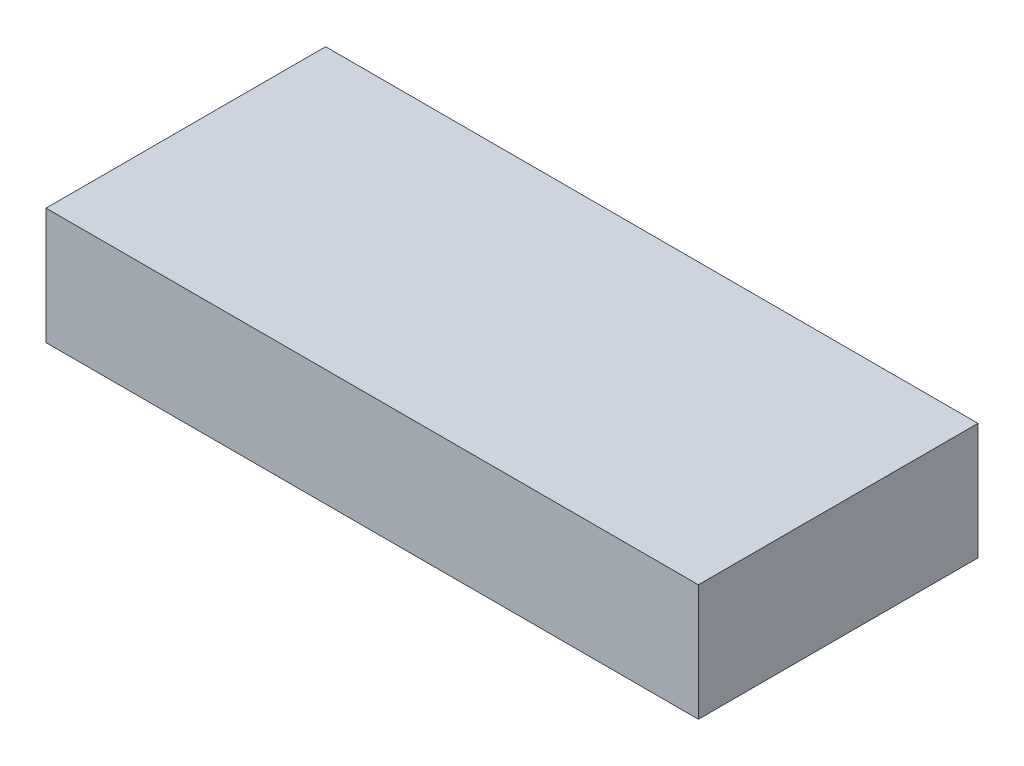
ISO-10303-21;
HEADER;
FILE_DESCRIPTION(('STEP AP214'),'2;1');
FILE_NAME('part.step','',(''),(''),'','','');
FILE_SCHEMA(('AUTOMOTIVE_DESIGN { 1 0 10303 214 1 1 1 1 }'));
ENDSEC;
DATA;
#1=APPLICATION_CONTEXT('core data for automotive mechanical design processes');
#2=APPLICATION_PROTOCOL_DEFINITION('international standard','automotive_design',2000,#1);
#3=PRODUCT_CONTEXT('',#1,'mechanical');
#4=PRODUCT('Part','Part','',(#3));
#5=PRODUCT_RELATED_PRODUCT_CATEGORY('part','',(#4));
#6=PRODUCT_DEFINITION_FORMATION('','',#4);
#7=PRODUCT_DEFINITION_CONTEXT('part definition',#1,'design');
#8=PRODUCT_DEFINITION('design','',#6,#7);
#9=PRODUCT_DEFINITION_SHAPE('','',#8);
#10=(LENGTH_UNIT() NAMED_UNIT(*) SI_UNIT(.MILLI.,.METRE.));
#11=(NAMED_UNIT(*) PLANE_ANGLE_UNIT() SI_UNIT($,.RADIAN.));
#12=(NAMED_UNIT(*) SI_UNIT($,.STERADIAN.) SOLID_ANGLE_UNIT());
#13=UNCERTAINTY_MEASURE_WITH_UNIT(LENGTH_MEASURE(1.E-05),#10,'distance_accuracy_value','');
#14=(GEOMETRIC_REPRESENTATION_CONTEXT(3) GLOBAL_UNCERTAINTY_ASSIGNED_CONTEXT((#13)) GLOBAL_UNIT_ASSIGNED_CONTEXT((#10,
#11,#12)) REPRESENTATION_CONTEXT('',''));
#15=CARTESIAN_POINT('',(0.,0.,0.));
#16=DIRECTION('',(0.,0.,1.));
#17=DIRECTION('',(1.,0.,0.));
#18=AXIS2_PLACEMENT_3D('',#15,#16,#17);
#19=CARTESIAN_POINT('',(-140.,25.,60.));
#20=DIRECTION('',(1.,0.,0.));
#21=DIRECTION('',(0.,0.,-1.));
#22=AXIS2_PLACEMENT_3D('',#19,#20,#21);
#23=PLANE('',#22);
#24=DIRECTION('',(0.,0.,1.));
#25=VECTOR('',#24,1.);
#26=CARTESIAN_POINT('',(-140.,-25.,60.));
#27=LINE('',#26,#25);
#28=CARTESIAN_POINT('',(-140.,-25.,-60.));
#29=VERTEX_POINT('',#28);
#30=CARTESIAN_POINT('',(-140.,-25.,60.));
#31=VERTEX_POINT('',#30);
#32=EDGE_CURVE('E95',#29,#31,#27,.T.);
#33=ORIENTED_EDGE('',*,*,#32,.T.);
#34=DIRECTION('',(0.,-1.,0.));
#35=VECTOR('',#34,1.);
#36=CARTESIAN_POINT('',(-140.,25.,60.));
#37=LINE('',#36,#35);
#38=CARTESIAN_POINT('',(-140.,25.,60.));
#39=VERTEX_POINT('',#38);
#40=EDGE_CURVE('E11',#39,#31,#37,.T.);
#41=ORIENTED_EDGE('',*,*,#40,.F.);
#42=DIRECTION('',(0.,0.,1.));
#43=VECTOR('',#42,1.);
#44=CARTESIAN_POINT('',(-140.,25.,60.));
#45=LINE('',#44,#43);
#46=CARTESIAN_POINT('',(-140.,25.,-60.));
#47=VERTEX_POINT('',#46);
#48=EDGE_CURVE('E83',#47,#39,#45,.T.);
#49=ORIENTED_EDGE('',*,*,#48,.F.);
#50=DIRECTION('',(0.,-1.,0.));
#51=VECTOR('',#50,1.);
#52=CARTESIAN_POINT('',(-140.,25.,-60.));
#53=LINE('',#52,#51);
#54=EDGE_CURVE('E91',#47,#29,#53,.T.);
#55=ORIENTED_EDGE('',*,*,#54,.T.);
#56=EDGE_LOOP('',(#33,#41,#49,#55));
#57=FACE_BOUND('',#56,.T.);
#58=ADVANCED_FACE('F32',(#57),#23,.F.);
#59=CARTESIAN_POINT('',(140.,25.,60.));
#60=DIRECTION('',(0.,0.,-1.));
#61=DIRECTION('',(-1.,0.,0.));
#62=AXIS2_PLACEMENT_3D('',#59,#60,#61);
#63=PLANE('',#62);
#64=DIRECTION('',(1.,0.,0.));
#65=VECTOR('',#64,1.);
#66=CARTESIAN_POINT('',(140.,-25.,60.));
#67=LINE('',#66,#65);
#68=CARTESIAN_POINT('',(140.,-25.,60.));
#69=VERTEX_POINT('',#68);
#70=EDGE_CURVE('E87',#31,#69,#67,.T.);
#71=ORIENTED_EDGE('',*,*,#70,.T.);
#72=DIRECTION('',(0.,-1.,0.));
#73=VECTOR('',#72,1.);
#74=CARTESIAN_POINT('',(140.,25.,60.));
#75=LINE('',#74,#73);
#76=CARTESIAN_POINT('',(140.,25.,60.));
#77=VERTEX_POINT('',#76);
#78=EDGE_CURVE('E40',#77,#69,#75,.T.);
#79=ORIENTED_EDGE('',*,*,#78,.F.);
#80=DIRECTION('',(1.,0.,0.));
#81=VECTOR('',#80,1.);
#82=CARTESIAN_POINT('',(140.,25.,60.));
#83=LINE('',#82,#81);
#84=EDGE_CURVE('E78',#39,#77,#83,.T.);
#85=ORIENTED_EDGE('',*,*,#84,.F.);
#86=ORIENTED_EDGE('',*,*,#40,.T.);
#87=EDGE_LOOP('',(#71,#79,#85,#86));
#88=FACE_BOUND('',#87,.T.);
#89=ADVANCED_FACE('F86',(#88),#63,.F.);
#90=CARTESIAN_POINT('',(140.,25.,60.));
#91=DIRECTION('',(-1.,0.,0.));
#92=DIRECTION('',(0.,0.,1.));
#93=AXIS2_PLACEMENT_3D('',#90,#91,#92);
#94=PLANE('',#93);
#95=DIRECTION('',(0.,0.,-1.));
#96=VECTOR('',#95,1.);
#97=CARTESIAN_POINT('',(140.,-25.,60.));
#98=LINE('',#97,#96);
#99=CARTESIAN_POINT('',(140.,-25.,-60.));
#100=VERTEX_POINT('',#99);
#101=EDGE_CURVE('E65',#69,#100,#98,.T.);
#102=ORIENTED_EDGE('',*,*,#101,.T.);
#103=DIRECTION('',(0.,-1.,0.));
#104=VECTOR('',#103,1.);
#105=CARTESIAN_POINT('',(140.,25.,-60.));
#106=LINE('',#105,#104);
#107=CARTESIAN_POINT('',(140.,25.,-60.));
#108=VERTEX_POINT('',#107);
#109=EDGE_CURVE('E88',#108,#100,#106,.T.);
#110=ORIENTED_EDGE('',*,*,#109,.F.);
#111=DIRECTION('',(0.,0.,-1.));
#112=VECTOR('',#111,1.);
#113=CARTESIAN_POINT('',(140.,25.,60.));
#114=LINE('',#113,#112);
#115=EDGE_CURVE('E81',#77,#108,#114,.T.);
#116=ORIENTED_EDGE('',*,*,#115,.F.);
#117=ORIENTED_EDGE('',*,*,#78,.T.);
#118=EDGE_LOOP('',(#102,#110,#116,#117));
#119=FACE_BOUND('',#118,.T.);
#120=ADVANCED_FACE('F89',(#119),#94,.F.);
#121=CARTESIAN_POINT('',(140.,25.,-60.));
#122=DIRECTION('',(0.,0.,1.));
#123=DIRECTION('',(1.,0.,0.));
#124=AXIS2_PLACEMENT_3D('',#121,#122,#123);
#125=PLANE('',#124);
#126=DIRECTION('',(-1.,0.,0.));
#127=VECTOR('',#126,1.);
#128=CARTESIAN_POINT('',(140.,-25.,-60.));
#129=LINE('',#128,#127);
#130=EDGE_CURVE('E71',#100,#29,#129,.T.);
#131=ORIENTED_EDGE('',*,*,#130,.T.);
#132=ORIENTED_EDGE('',*,*,#54,.F.);
#133=DIRECTION('',(-1.,0.,0.));
#134=VECTOR('',#133,1.);
#135=CARTESIAN_POINT('',(140.,25.,-60.));
#136=LINE('',#135,#134);
#137=EDGE_CURVE('E48',#108,#47,#136,.T.);
#138=ORIENTED_EDGE('',*,*,#137,.F.);
#139=ORIENTED_EDGE('',*,*,#109,.T.);
#140=EDGE_LOOP('',(#131,#132,#138,#139));
#141=FACE_BOUND('',#140,.T.);
#142=ADVANCED_FACE('F102',(#141),#125,.F.);
#143=CARTESIAN_POINT('',(0.,25.,0.));
#144=DIRECTION('',(0.,1.,0.));
#145=DIRECTION('',(0.,0.,1.));
#146=AXIS2_PLACEMENT_3D('',#143,#144,#145);
#147=PLANE('',#146);
#148=ORIENTED_EDGE('',*,*,#48,.T.);
#149=ORIENTED_EDGE('',*,*,#84,.T.);
#150=ORIENTED_EDGE('',*,*,#115,.T.);
#151=ORIENTED_EDGE('',*,*,#137,.T.);
#152=EDGE_LOOP('',(#148,#149,#150,#151));
#153=FACE_BOUND('',#152,.T.);
#154=ADVANCED_FACE('F79',(#153),#147,.T.);
#155=CARTESIAN_POINT('',(0.,-25.,0.));
#156=DIRECTION('',(0.,1.,0.));
#157=DIRECTION('',(0.,0.,1.));
#158=AXIS2_PLACEMENT_3D('',#155,#156,#157);
#159=PLANE('',#158);
#160=ORIENTED_EDGE('',*,*,#32,.F.);
#161=ORIENTED_EDGE('',*,*,#130,.F.);
#162=ORIENTED_EDGE('',*,*,#101,.F.);
#163=ORIENTED_EDGE('',*,*,#70,.F.);
#164=EDGE_LOOP('',(#160,#161,#162,#163));
#165=FACE_BOUND('',#164,.T.);
#166=ADVANCED_FACE('F105',(#165),#159,.F.);
#167=CLOSED_SHELL('',(#58,#89,#120,#142,#154,#166));
#168=MANIFOLD_SOLID_BREP('B2',#167);
#169=ADVANCED_BREP_SHAPE_REPRESENTATION('',(#18,#168),#14);
#170=SHAPE_DEFINITION_REPRESENTATION(#9,#169);
ENDSEC;
END-ISO-10303-21;
